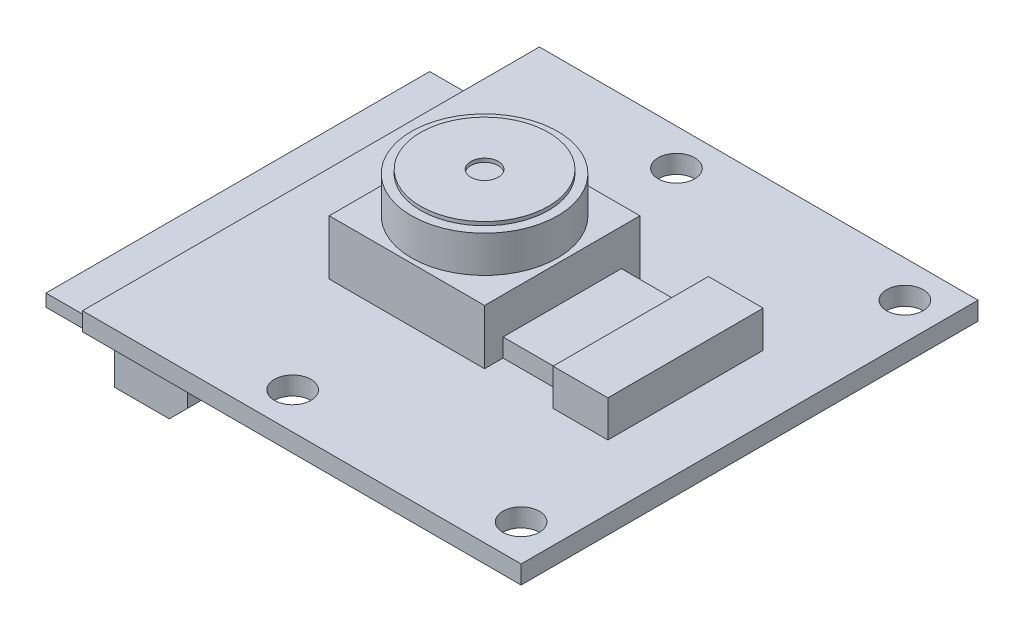
ISO-10303-21;
HEADER;
FILE_DESCRIPTION(('STEP AP214'),'2;1');
FILE_NAME('part.step','',(''),(''),'','','');
FILE_SCHEMA(('AUTOMOTIVE_DESIGN { 1 0 10303 214 1 1 1 1 }'));
ENDSEC;
DATA;
#1=APPLICATION_CONTEXT('core data for automotive mechanical design processes');
#2=APPLICATION_PROTOCOL_DEFINITION('international standard','automotive_design',2000,#1);
#3=PRODUCT_CONTEXT('',#1,'mechanical');
#4=PRODUCT('Part','Part','',(#3));
#5=PRODUCT_RELATED_PRODUCT_CATEGORY('part','',(#4));
#6=PRODUCT_DEFINITION_FORMATION('','',#4);
#7=PRODUCT_DEFINITION_CONTEXT('part definition',#1,'design');
#8=PRODUCT_DEFINITION('design','',#6,#7);
#9=PRODUCT_DEFINITION_SHAPE('','',#8);
#10=(LENGTH_UNIT() NAMED_UNIT(*) SI_UNIT(.MILLI.,.METRE.));
#11=(NAMED_UNIT(*) PLANE_ANGLE_UNIT() SI_UNIT($,.RADIAN.));
#12=(NAMED_UNIT(*) SI_UNIT($,.STERADIAN.) SOLID_ANGLE_UNIT());
#13=UNCERTAINTY_MEASURE_WITH_UNIT(LENGTH_MEASURE(1.E-05),#10,'distance_accuracy_value','');
#14=(GEOMETRIC_REPRESENTATION_CONTEXT(3) GLOBAL_UNCERTAINTY_ASSIGNED_CONTEXT((#13)) GLOBAL_UNIT_ASSIGNED_CONTEXT((#10,
#11,#12)) REPRESENTATION_CONTEXT('',''));
#15=CARTESIAN_POINT('',(0.,0.,0.));
#16=DIRECTION('',(0.,0.,1.));
#17=DIRECTION('',(1.,0.,0.));
#18=AXIS2_PLACEMENT_3D('',#15,#16,#17);
#19=CARTESIAN_POINT('',(-11.,-2.5,11.75));
#20=DIRECTION('',(-1.,0.,0.));
#21=DIRECTION('',(0.,0.,1.));
#22=AXIS2_PLACEMENT_3D('',#19,#20,#21);
#23=PLANE('',#22);
#24=DIRECTION('',(0.,0.,1.));
#25=VECTOR('',#24,1.);
#26=CARTESIAN_POINT('',(-11.,0.,11.75));
#27=LINE('',#26,#25);
#28=CARTESIAN_POINT('',(-11.,0.,-11.75));
#29=VERTEX_POINT('',#28);
#30=CARTESIAN_POINT('',(-11.,0.,11.75));
#31=VERTEX_POINT('',#30);
#32=EDGE_CURVE('E238',#29,#31,#27,.T.);
#33=ORIENTED_EDGE('',*,*,#32,.F.);
#34=DIRECTION('',(0.,1.,0.));
#35=VECTOR('',#34,1.);
#36=CARTESIAN_POINT('',(-11.,-2.5,-11.75));
#37=LINE('',#36,#35);
#38=CARTESIAN_POINT('',(-11.,-2.5,-11.75));
#39=VERTEX_POINT('',#38);
#40=EDGE_CURVE('E270',#39,#29,#37,.T.);
#41=ORIENTED_EDGE('',*,*,#40,.F.);
#42=DIRECTION('',(0.,0.,1.));
#43=VECTOR('',#42,1.);
#44=CARTESIAN_POINT('',(-11.,-2.5,11.75));
#45=LINE('',#44,#43);
#46=CARTESIAN_POINT('',(-11.,-2.5,11.75));
#47=VERTEX_POINT('',#46);
#48=EDGE_CURVE('E248',#39,#47,#45,.T.);
#49=ORIENTED_EDGE('',*,*,#48,.T.);
#50=DIRECTION('',(0.,1.,0.));
#51=VECTOR('',#50,1.);
#52=CARTESIAN_POINT('',(-11.,-2.5,11.75));
#53=LINE('',#52,#51);
#54=EDGE_CURVE('E258',#47,#31,#53,.T.);
#55=ORIENTED_EDGE('',*,*,#54,.T.);
#56=EDGE_LOOP('',(#33,#41,#49,#55));
#57=FACE_BOUND('',#56,.T.);
#58=DIRECTION('',(0.,0.,1.));
#59=VECTOR('',#58,1.);
#60=CARTESIAN_POINT('',(-11.,-1.83652307247097,10.4967751313598));
#61=LINE('',#60,#59);
#62=CARTESIAN_POINT('',(-11.,-1.83652307247097,-10.4967751313598));
#63=VERTEX_POINT('',#62);
#64=CARTESIAN_POINT('',(-11.,-1.83652307247097,10.4967751313598));
#65=VERTEX_POINT('',#64);
#66=EDGE_CURVE('E877',#63,#65,#61,.T.);
#67=ORIENTED_EDGE('',*,*,#66,.F.);
#68=DIRECTION('',(0.,-1.,0.));
#69=VECTOR('',#68,1.);
#70=CARTESIAN_POINT('',(-11.,-1.83652307247097,-10.4967751313598));
#71=LINE('',#70,#69);
#72=CARTESIAN_POINT('',(-11.,-1.16347692752903,-10.4967751313598));
#73=VERTEX_POINT('',#72);
#74=EDGE_CURVE('E235',#73,#63,#71,.T.);
#75=ORIENTED_EDGE('',*,*,#74,.F.);
#76=DIRECTION('',(0.,0.,-1.));
#77=VECTOR('',#76,1.);
#78=CARTESIAN_POINT('',(-11.,-1.16347692752903,10.4967751313598));
#79=LINE('',#78,#77);
#80=CARTESIAN_POINT('',(-11.,-1.16347692752903,10.4967751313598));
#81=VERTEX_POINT('',#80);
#82=EDGE_CURVE('E231',#81,#73,#79,.T.);
#83=ORIENTED_EDGE('',*,*,#82,.F.);
#84=DIRECTION('',(0.,1.,0.));
#85=VECTOR('',#84,1.);
#86=CARTESIAN_POINT('',(-11.,-1.83652307247097,10.4967751313598));
#87=LINE('',#86,#85);
#88=EDGE_CURVE('E880',#65,#81,#87,.T.);
#89=ORIENTED_EDGE('',*,*,#88,.F.);
#90=EDGE_LOOP('',(#67,#75,#83,#89));
#91=FACE_BOUND('',#90,.T.);
#92=ADVANCED_FACE('F39',(#57,#91),#23,.T.);
#93=CARTESIAN_POINT('',(0.,1.,0.));
#94=DIRECTION('',(0.,1.,0.));
#95=DIRECTION('',(0.,0.,1.));
#96=AXIS2_PLACEMENT_3D('',#93,#94,#95);
#97=PLANE('',#96);
#98=CARTESIAN_POINT('',(-2.5,1.,10.5));
#99=DIRECTION('',(0.,1.,0.));
#100=DIRECTION('',(0.,0.,1.));
#101=AXIS2_PLACEMENT_3D('',#98,#99,#100);
#102=CIRCLE('',#101,1.);
#103=CARTESIAN_POINT('',(-2.5,1.,11.5));
#104=VERTEX_POINT('',#103);
#105=EDGE_CURVE('E852',#104,#104,#102,.T.);
#106=ORIENTED_EDGE('',*,*,#105,.F.);
#107=EDGE_LOOP('',(#106));
#108=FACE_BOUND('',#107,.T.);
#109=CARTESIAN_POINT('',(10.,1.,-10.5));
#110=DIRECTION('',(0.,1.,0.));
#111=DIRECTION('',(0.,0.,1.));
#112=AXIS2_PLACEMENT_3D('',#109,#110,#111);
#113=CIRCLE('',#112,0.999999999999999);
#114=CARTESIAN_POINT('',(10.,1.,-9.5));
#115=VERTEX_POINT('',#114);
#116=EDGE_CURVE('E843',#115,#115,#113,.T.);
#117=ORIENTED_EDGE('',*,*,#116,.F.);
#118=EDGE_LOOP('',(#117));
#119=FACE_BOUND('',#118,.T.);
#120=CARTESIAN_POINT('',(-2.5,1.,-10.5));
#121=DIRECTION('',(0.,1.,0.));
#122=DIRECTION('',(0.,0.,1.));
#123=AXIS2_PLACEMENT_3D('',#120,#121,#122);
#124=CIRCLE('',#123,1.);
#125=CARTESIAN_POINT('',(-2.5,1.,-9.49999999999999));
#126=VERTEX_POINT('',#125);
#127=EDGE_CURVE('E834',#126,#126,#124,.T.);
#128=ORIENTED_EDGE('',*,*,#127,.F.);
#129=EDGE_LOOP('',(#128));
#130=FACE_BOUND('',#129,.T.);
#131=CARTESIAN_POINT('',(10.,1.,10.5));
#132=DIRECTION('',(0.,1.,0.));
#133=DIRECTION('',(0.,0.,1.));
#134=AXIS2_PLACEMENT_3D('',#131,#132,#133);
#135=CIRCLE('',#134,0.999999999999999);
#136=CARTESIAN_POINT('',(10.,1.,11.5));
#137=VERTEX_POINT('',#136);
#138=EDGE_CURVE('E851',#137,#137,#135,.T.);
#139=ORIENTED_EDGE('',*,*,#138,.F.);
#140=EDGE_LOOP('',(#139));
#141=FACE_BOUND('',#140,.T.);
#142=DIRECTION('',(0.,0.,-1.));
#143=VECTOR('',#142,1.);
#144=CARTESIAN_POINT('',(12.,1.,-12.5));
#145=LINE('',#144,#143);
#146=CARTESIAN_POINT('',(12.,1.,12.5));
#147=VERTEX_POINT('',#146);
#148=CARTESIAN_POINT('',(12.,1.,-12.5));
#149=VERTEX_POINT('',#148);
#150=EDGE_CURVE('E412',#147,#149,#145,.T.);
#151=ORIENTED_EDGE('',*,*,#150,.T.);
#152=DIRECTION('',(-1.,0.,0.));
#153=VECTOR('',#152,1.);
#154=CARTESIAN_POINT('',(-12.,1.,-12.5));
#155=LINE('',#154,#153);
#156=CARTESIAN_POINT('',(-12.,1.,-12.5));
#157=VERTEX_POINT('',#156);
#158=EDGE_CURVE('E416',#149,#157,#155,.T.);
#159=ORIENTED_EDGE('',*,*,#158,.T.);
#160=DIRECTION('',(0.,0.,1.));
#161=VECTOR('',#160,1.);
#162=CARTESIAN_POINT('',(-12.,1.,-12.5));
#163=LINE('',#162,#161);
#164=CARTESIAN_POINT('',(-12.,1.,12.5));
#165=VERTEX_POINT('',#164);
#166=EDGE_CURVE('E420',#157,#165,#163,.T.);
#167=ORIENTED_EDGE('',*,*,#166,.T.);
#168=DIRECTION('',(1.,0.,0.));
#169=VECTOR('',#168,1.);
#170=CARTESIAN_POINT('',(-12.,1.,12.5));
#171=LINE('',#170,#169);
#172=EDGE_CURVE('E423',#165,#147,#171,.T.);
#173=ORIENTED_EDGE('',*,*,#172,.T.);
#174=EDGE_LOOP('',(#151,#159,#167,#173));
#175=FACE_BOUND('',#174,.T.);
#176=DIRECTION('',(0.,0.,1.));
#177=VECTOR('',#176,1.);
#178=CARTESIAN_POINT('',(5.5,1.,4.2541908743633));
#179=LINE('',#178,#177);
#180=CARTESIAN_POINT('',(5.5,1.,3.2380612751322));
#181=VERTEX_POINT('',#180);
#182=CARTESIAN_POINT('',(5.5,1.,4.2541908743633));
#183=VERTEX_POINT('',#182);
#184=EDGE_CURVE('E337',#181,#183,#179,.T.);
#185=ORIENTED_EDGE('',*,*,#184,.F.);
#186=DIRECTION('',(1.,0.,0.));
#187=VECTOR('',#186,1.);
#188=CARTESIAN_POINT('',(1.75,1.,3.2380612751322));
#189=LINE('',#188,#187);
#190=CARTESIAN_POINT('',(1.75,1.,3.2380612751322));
#191=VERTEX_POINT('',#190);
#192=EDGE_CURVE('E273',#191,#181,#189,.T.);
#193=ORIENTED_EDGE('',*,*,#192,.F.);
#194=DIRECTION('',(0.,0.,-1.));
#195=VECTOR('',#194,1.);
#196=CARTESIAN_POINT('',(1.75,1.,4.25));
#197=LINE('',#196,#195);
#198=CARTESIAN_POINT('',(1.75,1.,4.25));
#199=VERTEX_POINT('',#198);
#200=EDGE_CURVE('E384',#199,#191,#197,.T.);
#201=ORIENTED_EDGE('',*,*,#200,.F.);
#202=DIRECTION('',(1.,0.,0.));
#203=VECTOR('',#202,1.);
#204=CARTESIAN_POINT('',(-6.75,1.,4.25));
#205=LINE('',#204,#203);
#206=CARTESIAN_POINT('',(-6.75,1.,4.25));
#207=VERTEX_POINT('',#206);
#208=EDGE_CURVE('E374',#207,#199,#205,.T.);
#209=ORIENTED_EDGE('',*,*,#208,.F.);
#210=DIRECTION('',(0.,0.,1.));
#211=VECTOR('',#210,1.);
#212=CARTESIAN_POINT('',(-6.75,1.,4.25));
#213=LINE('',#212,#211);
#214=CARTESIAN_POINT('',(-6.75,1.,-4.25));
#215=VERTEX_POINT('',#214);
#216=EDGE_CURVE('E391',#215,#207,#213,.T.);
#217=ORIENTED_EDGE('',*,*,#216,.F.);
#218=DIRECTION('',(-1.,0.,0.));
#219=VECTOR('',#218,1.);
#220=CARTESIAN_POINT('',(-6.75,1.,-4.25));
#221=LINE('',#220,#219);
#222=CARTESIAN_POINT('',(1.75,1.,-4.25));
#223=VERTEX_POINT('',#222);
#224=EDGE_CURVE('E388',#223,#215,#221,.T.);
#225=ORIENTED_EDGE('',*,*,#224,.F.);
#226=CARTESIAN_POINT('',(1.75,1.,-3.23806127513216));
#227=VERTEX_POINT('',#226);
#228=EDGE_CURVE('E362',#227,#223,#197,.T.);
#229=ORIENTED_EDGE('',*,*,#228,.F.);
#230=DIRECTION('',(-1.,0.,0.));
#231=VECTOR('',#230,1.);
#232=CARTESIAN_POINT('',(1.75,1.,-3.23806127513216));
#233=LINE('',#232,#231);
#234=CARTESIAN_POINT('',(5.5,1.,-3.23806127513216));
#235=VERTEX_POINT('',#234);
#236=EDGE_CURVE('E287',#235,#227,#233,.T.);
#237=ORIENTED_EDGE('',*,*,#236,.F.);
#238=CARTESIAN_POINT('',(5.5,1.,-4.2458091256367));
#239=VERTEX_POINT('',#238);
#240=EDGE_CURVE('E338',#239,#235,#179,.T.);
#241=ORIENTED_EDGE('',*,*,#240,.F.);
#242=DIRECTION('',(-1.,0.,0.));
#243=VECTOR('',#242,1.);
#244=CARTESIAN_POINT('',(5.5,1.,-4.2458091256367));
#245=LINE('',#244,#243);
#246=CARTESIAN_POINT('',(8.5,1.,-4.2458091256367));
#247=VERTEX_POINT('',#246);
#248=EDGE_CURVE('E334',#247,#239,#245,.T.);
#249=ORIENTED_EDGE('',*,*,#248,.F.);
#250=DIRECTION('',(0.,0.,-1.));
#251=VECTOR('',#250,1.);
#252=CARTESIAN_POINT('',(8.5,1.,4.2541908743633));
#253=LINE('',#252,#251);
#254=CARTESIAN_POINT('',(8.5,1.,4.2541908743633));
#255=VERTEX_POINT('',#254);
#256=EDGE_CURVE('E315',#255,#247,#253,.T.);
#257=ORIENTED_EDGE('',*,*,#256,.F.);
#258=DIRECTION('',(1.,0.,0.));
#259=VECTOR('',#258,1.);
#260=CARTESIAN_POINT('',(5.5,1.,4.2541908743633));
#261=LINE('',#260,#259);
#262=EDGE_CURVE('E321',#183,#255,#261,.T.);
#263=ORIENTED_EDGE('',*,*,#262,.F.);
#264=EDGE_LOOP('',(#185,#193,#201,#209,#217,#225,#229,#237,#241,#249,#257,#263));
#265=FACE_BOUND('',#264,.T.);
#266=ADVANCED_FACE('F505',(#108,#119,#130,#141,#175,#265),#97,.T.);
#267=CARTESIAN_POINT('',(1.75,4.,4.25));
#268=DIRECTION('',(-1.,0.,0.));
#269=DIRECTION('',(0.,0.,1.));
#270=AXIS2_PLACEMENT_3D('',#267,#268,#269);
#271=PLANE('',#270);
#272=DIRECTION('',(0.,-1.,0.));
#273=VECTOR('',#272,1.);
#274=CARTESIAN_POINT('',(1.75,2.,3.2380612751322));
#275=LINE('',#274,#273);
#276=CARTESIAN_POINT('',(1.75,2.,3.2380612751322));
#277=VERTEX_POINT('',#276);
#278=EDGE_CURVE('E312',#277,#191,#275,.T.);
#279=ORIENTED_EDGE('',*,*,#278,.F.);
#280=DIRECTION('',(0.,0.,1.));
#281=VECTOR('',#280,1.);
#282=CARTESIAN_POINT('',(1.75,2.,-3.23806127513216));
#283=LINE('',#282,#281);
#284=CARTESIAN_POINT('',(1.75,2.,-3.23806127513216));
#285=VERTEX_POINT('',#284);
#286=EDGE_CURVE('E282',#285,#277,#283,.T.);
#287=ORIENTED_EDGE('',*,*,#286,.F.);
#288=DIRECTION('',(0.,-1.,0.));
#289=VECTOR('',#288,1.);
#290=CARTESIAN_POINT('',(1.75,2.,-3.23806127513216));
#291=LINE('',#290,#289);
#292=EDGE_CURVE('E297',#285,#227,#291,.T.);
#293=ORIENTED_EDGE('',*,*,#292,.T.);
#294=ORIENTED_EDGE('',*,*,#228,.T.);
#295=DIRECTION('',(0.,-1.,0.));
#296=VECTOR('',#295,1.);
#297=CARTESIAN_POINT('',(1.75,4.,-4.25));
#298=LINE('',#297,#296);
#299=CARTESIAN_POINT('',(1.75,4.,-4.25));
#300=VERTEX_POINT('',#299);
#301=EDGE_CURVE('E407',#300,#223,#298,.T.);
#302=ORIENTED_EDGE('',*,*,#301,.F.);
#303=DIRECTION('',(0.,0.,-1.));
#304=VECTOR('',#303,1.);
#305=CARTESIAN_POINT('',(1.75,4.,4.25));
#306=LINE('',#305,#304);
#307=CARTESIAN_POINT('',(1.75,4.,4.25));
#308=VERTEX_POINT('',#307);
#309=EDGE_CURVE('E369',#308,#300,#306,.T.);
#310=ORIENTED_EDGE('',*,*,#309,.F.);
#311=DIRECTION('',(0.,-1.,0.));
#312=VECTOR('',#311,1.);
#313=CARTESIAN_POINT('',(1.75,4.,4.25));
#314=LINE('',#313,#312);
#315=EDGE_CURVE('E383',#308,#199,#314,.T.);
#316=ORIENTED_EDGE('',*,*,#315,.T.);
#317=ORIENTED_EDGE('',*,*,#200,.T.);
#318=EDGE_LOOP('',(#279,#287,#293,#294,#302,#310,#316,#317));
#319=FACE_BOUND('',#318,.T.);
#320=ADVANCED_FACE('F508',(#319),#271,.F.);
#321=CARTESIAN_POINT('',(5.5,3.,4.2541908743633));
#322=DIRECTION('',(1.,0.,0.));
#323=DIRECTION('',(0.,0.,-1.));
#324=AXIS2_PLACEMENT_3D('',#321,#322,#323);
#325=PLANE('',#324);
#326=DIRECTION('',(0.,-1.,0.));
#327=VECTOR('',#326,1.);
#328=CARTESIAN_POINT('',(5.5,2.,3.2380612751322));
#329=LINE('',#328,#327);
#330=CARTESIAN_POINT('',(5.5,2.,3.2380612751322));
#331=VERTEX_POINT('',#330);
#332=EDGE_CURVE('E308',#331,#181,#329,.T.);
#333=ORIENTED_EDGE('',*,*,#332,.T.);
#334=ORIENTED_EDGE('',*,*,#184,.T.);
#335=DIRECTION('',(0.,-1.,0.));
#336=VECTOR('',#335,1.);
#337=CARTESIAN_POINT('',(5.5,3.,4.2541908743633));
#338=LINE('',#337,#336);
#339=CARTESIAN_POINT('',(5.5,3.,4.2541908743633));
#340=VERTEX_POINT('',#339);
#341=EDGE_CURVE('E347',#340,#183,#338,.T.);
#342=ORIENTED_EDGE('',*,*,#341,.F.);
#343=DIRECTION('',(0.,0.,1.));
#344=VECTOR('',#343,1.);
#345=CARTESIAN_POINT('',(5.5,3.,4.2541908743633));
#346=LINE('',#345,#344);
#347=CARTESIAN_POINT('',(5.5,3.,-4.2458091256367));
#348=VERTEX_POINT('',#347);
#349=EDGE_CURVE('E324',#348,#340,#346,.T.);
#350=ORIENTED_EDGE('',*,*,#349,.F.);
#351=DIRECTION('',(0.,-1.,0.));
#352=VECTOR('',#351,1.);
#353=CARTESIAN_POINT('',(5.5,3.,-4.2458091256367));
#354=LINE('',#353,#352);
#355=EDGE_CURVE('E351',#348,#239,#354,.T.);
#356=ORIENTED_EDGE('',*,*,#355,.T.);
#357=ORIENTED_EDGE('',*,*,#240,.T.);
#358=DIRECTION('',(0.,-1.,0.));
#359=VECTOR('',#358,1.);
#360=CARTESIAN_POINT('',(5.5,2.,-3.23806127513216));
#361=LINE('',#360,#359);
#362=CARTESIAN_POINT('',(5.5,2.,-3.23806127513216));
#363=VERTEX_POINT('',#362);
#364=EDGE_CURVE('E305',#363,#235,#361,.T.);
#365=ORIENTED_EDGE('',*,*,#364,.F.);
#366=DIRECTION('',(0.,0.,-1.));
#367=VECTOR('',#366,1.);
#368=CARTESIAN_POINT('',(5.5,2.,-3.23806127513216));
#369=LINE('',#368,#367);
#370=EDGE_CURVE('E291',#331,#363,#369,.T.);
#371=ORIENTED_EDGE('',*,*,#370,.F.);
#372=EDGE_LOOP('',(#333,#334,#342,#350,#356,#357,#365,#371));
#373=FACE_BOUND('',#372,.T.);
#374=ADVANCED_FACE('F582',(#373),#325,.F.);
#375=CARTESIAN_POINT('',(12.,1.,-12.5));
#376=DIRECTION('',(-1.,0.,0.));
#377=DIRECTION('',(0.,0.,1.));
#378=AXIS2_PLACEMENT_3D('',#375,#376,#377);
#379=PLANE('',#378);
#380=DIRECTION('',(0.,0.,-1.));
#381=VECTOR('',#380,1.);
#382=CARTESIAN_POINT('',(12.,0.,-12.5));
#383=LINE('',#382,#381);
#384=CARTESIAN_POINT('',(12.,0.,12.5));
#385=VERTEX_POINT('',#384);
#386=CARTESIAN_POINT('',(12.,0.,-12.5));
#387=VERTEX_POINT('',#386);
#388=EDGE_CURVE('E411',#385,#387,#383,.T.);
#389=ORIENTED_EDGE('',*,*,#388,.T.);
#390=DIRECTION('',(0.,-1.,0.));
#391=VECTOR('',#390,1.);
#392=CARTESIAN_POINT('',(12.,1.,-12.5));
#393=LINE('',#392,#391);
#394=EDGE_CURVE('E368',#149,#387,#393,.T.);
#395=ORIENTED_EDGE('',*,*,#394,.F.);
#396=ORIENTED_EDGE('',*,*,#150,.F.);
#397=DIRECTION('',(0.,-1.,0.));
#398=VECTOR('',#397,1.);
#399=CARTESIAN_POINT('',(12.,1.,12.5));
#400=LINE('',#399,#398);
#401=EDGE_CURVE('E426',#147,#385,#400,.T.);
#402=ORIENTED_EDGE('',*,*,#401,.T.);
#403=EDGE_LOOP('',(#389,#395,#396,#402));
#404=FACE_BOUND('',#403,.T.);
#405=ADVANCED_FACE('F492',(#404),#379,.F.);
#406=CARTESIAN_POINT('',(-12.,1.,-12.5));
#407=DIRECTION('',(0.,0.,1.));
#408=DIRECTION('',(1.,0.,0.));
#409=AXIS2_PLACEMENT_3D('',#406,#407,#408);
#410=PLANE('',#409);
#411=DIRECTION('',(-1.,0.,0.));
#412=VECTOR('',#411,1.);
#413=CARTESIAN_POINT('',(-12.,0.,-12.5));
#414=LINE('',#413,#412);
#415=CARTESIAN_POINT('',(-12.,0.,-12.5));
#416=VERTEX_POINT('',#415);
#417=EDGE_CURVE('E430',#387,#416,#414,.T.);
#418=ORIENTED_EDGE('',*,*,#417,.T.);
#419=DIRECTION('',(0.,-1.,0.));
#420=VECTOR('',#419,1.);
#421=CARTESIAN_POINT('',(-12.,1.,-12.5));
#422=LINE('',#421,#420);
#423=EDGE_CURVE('E445',#157,#416,#422,.T.);
#424=ORIENTED_EDGE('',*,*,#423,.F.);
#425=ORIENTED_EDGE('',*,*,#158,.F.);
#426=ORIENTED_EDGE('',*,*,#394,.T.);
#427=EDGE_LOOP('',(#418,#424,#425,#426));
#428=FACE_BOUND('',#427,.T.);
#429=ADVANCED_FACE('F503',(#428),#410,.F.);
#430=CARTESIAN_POINT('',(-12.,1.,-12.5));
#431=DIRECTION('',(1.,0.,0.));
#432=DIRECTION('',(0.,0.,-1.));
#433=AXIS2_PLACEMENT_3D('',#430,#431,#432);
#434=PLANE('',#433);
#435=DIRECTION('',(0.,0.,1.));
#436=VECTOR('',#435,1.);
#437=CARTESIAN_POINT('',(-12.,0.,-12.5));
#438=LINE('',#437,#436);
#439=CARTESIAN_POINT('',(-12.,0.,12.5));
#440=VERTEX_POINT('',#439);
#441=EDGE_CURVE('E433',#416,#440,#438,.T.);
#442=ORIENTED_EDGE('',*,*,#441,.T.);
#443=DIRECTION('',(0.,-1.,0.));
#444=VECTOR('',#443,1.);
#445=CARTESIAN_POINT('',(-12.,1.,12.5));
#446=LINE('',#445,#444);
#447=EDGE_CURVE('E441',#165,#440,#446,.T.);
#448=ORIENTED_EDGE('',*,*,#447,.F.);
#449=ORIENTED_EDGE('',*,*,#166,.F.);
#450=ORIENTED_EDGE('',*,*,#423,.T.);
#451=EDGE_LOOP('',(#442,#448,#449,#450));
#452=FACE_BOUND('',#451,.T.);
#453=ADVANCED_FACE('F500',(#452),#434,.F.);
#454=CARTESIAN_POINT('',(-12.,1.,12.5));
#455=DIRECTION('',(0.,0.,-1.));
#456=DIRECTION('',(-1.,0.,0.));
#457=AXIS2_PLACEMENT_3D('',#454,#455,#456);
#458=PLANE('',#457);
#459=DIRECTION('',(1.,0.,0.));
#460=VECTOR('',#459,1.);
#461=CARTESIAN_POINT('',(-12.,0.,12.5));
#462=LINE('',#461,#460);
#463=EDGE_CURVE('E417',#440,#385,#462,.T.);
#464=ORIENTED_EDGE('',*,*,#463,.T.);
#465=ORIENTED_EDGE('',*,*,#401,.F.);
#466=ORIENTED_EDGE('',*,*,#172,.F.);
#467=ORIENTED_EDGE('',*,*,#447,.T.);
#468=EDGE_LOOP('',(#464,#465,#466,#467));
#469=FACE_BOUND('',#468,.T.);
#470=ADVANCED_FACE('F484',(#469),#458,.F.);
#471=CARTESIAN_POINT('',(0.,0.,0.));
#472=DIRECTION('',(0.,1.,0.));
#473=DIRECTION('',(0.,0.,1.));
#474=AXIS2_PLACEMENT_3D('',#471,#472,#473);
#475=PLANE('',#474);
#476=CARTESIAN_POINT('',(-2.5,0.,10.5));
#477=DIRECTION('',(0.,1.,0.));
#478=DIRECTION('',(0.,0.,1.));
#479=AXIS2_PLACEMENT_3D('',#476,#477,#478);
#480=CIRCLE('',#479,1.);
#481=CARTESIAN_POINT('',(-2.5,0.,11.5));
#482=VERTEX_POINT('',#481);
#483=EDGE_CURVE('E847',#482,#482,#480,.T.);
#484=ORIENTED_EDGE('',*,*,#483,.T.);
#485=EDGE_LOOP('',(#484));
#486=FACE_BOUND('',#485,.T.);
#487=CARTESIAN_POINT('',(10.,0.,-10.5));
#488=DIRECTION('',(0.,1.,0.));
#489=DIRECTION('',(0.,0.,1.));
#490=AXIS2_PLACEMENT_3D('',#487,#488,#489);
#491=CIRCLE('',#490,0.999999999999999);
#492=CARTESIAN_POINT('',(10.,0.,-9.5));
#493=VERTEX_POINT('',#492);
#494=EDGE_CURVE('E856',#493,#493,#491,.T.);
#495=ORIENTED_EDGE('',*,*,#494,.T.);
#496=EDGE_LOOP('',(#495));
#497=FACE_BOUND('',#496,.T.);
#498=CARTESIAN_POINT('',(-2.5,0.,-10.5));
#499=DIRECTION('',(0.,1.,0.));
#500=DIRECTION('',(0.,0.,1.));
#501=AXIS2_PLACEMENT_3D('',#498,#499,#500);
#502=CIRCLE('',#501,1.);
#503=CARTESIAN_POINT('',(-2.5,0.,-9.49999999999999));
#504=VERTEX_POINT('',#503);
#505=EDGE_CURVE('E839',#504,#504,#502,.T.);
#506=ORIENTED_EDGE('',*,*,#505,.T.);
#507=EDGE_LOOP('',(#506));
#508=FACE_BOUND('',#507,.T.);
#509=CARTESIAN_POINT('',(10.,0.,10.5));
#510=DIRECTION('',(0.,1.,0.));
#511=DIRECTION('',(0.,0.,1.));
#512=AXIS2_PLACEMENT_3D('',#509,#510,#511);
#513=CIRCLE('',#512,0.999999999999999);
#514=CARTESIAN_POINT('',(10.,0.,11.5));
#515=VERTEX_POINT('',#514);
#516=EDGE_CURVE('E863',#515,#515,#513,.T.);
#517=ORIENTED_EDGE('',*,*,#516,.T.);
#518=EDGE_LOOP('',(#517));
#519=FACE_BOUND('',#518,.T.);
#520=DIRECTION('',(-1.,0.,0.));
#521=VECTOR('',#520,1.);
#522=CARTESIAN_POINT('',(-11.,0.,-11.75));
#523=LINE('',#522,#521);
#524=CARTESIAN_POINT('',(-7.,0.,-11.75));
#525=VERTEX_POINT('',#524);
#526=EDGE_CURVE('E253',#525,#29,#523,.T.);
#527=ORIENTED_EDGE('',*,*,#526,.T.);
#528=ORIENTED_EDGE('',*,*,#32,.T.);
#529=DIRECTION('',(1.,0.,0.));
#530=VECTOR('',#529,1.);
#531=CARTESIAN_POINT('',(-11.,0.,11.75));
#532=LINE('',#531,#530);
#533=CARTESIAN_POINT('',(-7.,0.,11.75));
#534=VERTEX_POINT('',#533);
#535=EDGE_CURVE('E243',#31,#534,#532,.T.);
#536=ORIENTED_EDGE('',*,*,#535,.T.);
#537=DIRECTION('',(0.,0.,-1.));
#538=VECTOR('',#537,1.);
#539=CARTESIAN_POINT('',(-7.,0.,11.75));
#540=LINE('',#539,#538);
#541=EDGE_CURVE('E263',#534,#525,#540,.T.);
#542=ORIENTED_EDGE('',*,*,#541,.T.);
#543=EDGE_LOOP('',(#527,#528,#536,#542));
#544=FACE_BOUND('',#543,.T.);
#545=ORIENTED_EDGE('',*,*,#388,.F.);
#546=ORIENTED_EDGE('',*,*,#463,.F.);
#547=ORIENTED_EDGE('',*,*,#441,.F.);
#548=ORIENTED_EDGE('',*,*,#417,.F.);
#549=EDGE_LOOP('',(#545,#546,#547,#548));
#550=FACE_BOUND('',#549,.T.);
#551=ADVANCED_FACE('F480',(#486,#497,#508,#519,#544,#550),#475,.F.);
#552=CARTESIAN_POINT('',(-6.75,4.,-4.25));
#553=DIRECTION('',(0.,0.,1.));
#554=DIRECTION('',(1.,0.,0.));
#555=AXIS2_PLACEMENT_3D('',#552,#553,#554);
#556=PLANE('',#555);
#557=ORIENTED_EDGE('',*,*,#224,.T.);
#558=DIRECTION('',(0.,-1.,0.));
#559=VECTOR('',#558,1.);
#560=CARTESIAN_POINT('',(-6.75,4.,-4.25));
#561=LINE('',#560,#559);
#562=CARTESIAN_POINT('',(-6.75,4.,-4.25));
#563=VERTEX_POINT('',#562);
#564=EDGE_CURVE('E403',#563,#215,#561,.T.);
#565=ORIENTED_EDGE('',*,*,#564,.F.);
#566=DIRECTION('',(-1.,0.,0.));
#567=VECTOR('',#566,1.);
#568=CARTESIAN_POINT('',(-6.75,4.,-4.25));
#569=LINE('',#568,#567);
#570=EDGE_CURVE('E373',#300,#563,#569,.T.);
#571=ORIENTED_EDGE('',*,*,#570,.F.);
#572=ORIENTED_EDGE('',*,*,#301,.T.);
#573=EDGE_LOOP('',(#557,#565,#571,#572));
#574=FACE_BOUND('',#573,.T.);
#575=ADVANCED_FACE('F483',(#574),#556,.F.);
#576=CARTESIAN_POINT('',(-6.75,4.,4.25));
#577=DIRECTION('',(1.,0.,0.));
#578=DIRECTION('',(0.,0.,-1.));
#579=AXIS2_PLACEMENT_3D('',#576,#577,#578);
#580=PLANE('',#579);
#581=ORIENTED_EDGE('',*,*,#216,.T.);
#582=DIRECTION('',(0.,-1.,0.));
#583=VECTOR('',#582,1.);
#584=CARTESIAN_POINT('',(-6.75,4.,4.25));
#585=LINE('',#584,#583);
#586=CARTESIAN_POINT('',(-6.75,4.,4.25));
#587=VERTEX_POINT('',#586);
#588=EDGE_CURVE('E400',#587,#207,#585,.T.);
#589=ORIENTED_EDGE('',*,*,#588,.F.);
#590=DIRECTION('',(0.,0.,1.));
#591=VECTOR('',#590,1.);
#592=CARTESIAN_POINT('',(-6.75,4.,4.25));
#593=LINE('',#592,#591);
#594=EDGE_CURVE('E377',#563,#587,#593,.T.);
#595=ORIENTED_EDGE('',*,*,#594,.F.);
#596=ORIENTED_EDGE('',*,*,#564,.T.);
#597=EDGE_LOOP('',(#581,#589,#595,#596));
#598=FACE_BOUND('',#597,.T.);
#599=ADVANCED_FACE('F535',(#598),#580,.F.);
#600=CARTESIAN_POINT('',(-6.75,4.,4.25));
#601=DIRECTION('',(0.,0.,-1.));
#602=DIRECTION('',(-1.,0.,0.));
#603=AXIS2_PLACEMENT_3D('',#600,#601,#602);
#604=PLANE('',#603);
#605=ORIENTED_EDGE('',*,*,#208,.T.);
#606=ORIENTED_EDGE('',*,*,#315,.F.);
#607=DIRECTION('',(1.,0.,0.));
#608=VECTOR('',#607,1.);
#609=CARTESIAN_POINT('',(-6.75,4.,4.25));
#610=LINE('',#609,#608);
#611=EDGE_CURVE('E380',#587,#308,#610,.T.);
#612=ORIENTED_EDGE('',*,*,#611,.F.);
#613=ORIENTED_EDGE('',*,*,#588,.T.);
#614=EDGE_LOOP('',(#605,#606,#612,#613));
#615=FACE_BOUND('',#614,.T.);
#616=ADVANCED_FACE('F542',(#615),#604,.F.);
#617=CARTESIAN_POINT('',(0.,4.,0.));
#618=DIRECTION('',(0.,-1.,0.));
#619=DIRECTION('',(0.,0.,-1.));
#620=AXIS2_PLACEMENT_3D('',#617,#618,#619);
#621=PLANE('',#620);
#622=CARTESIAN_POINT('',(-2.5,4.,0.));
#623=DIRECTION('',(0.,1.,0.));
#624=DIRECTION('',(0.,0.,1.));
#625=AXIS2_PLACEMENT_3D('',#622,#623,#624);
#626=CIRCLE('',#625,4.);
#627=CARTESIAN_POINT('',(-2.5,4.,4.));
#628=VERTEX_POINT('',#627);
#629=EDGE_CURVE('E363',#628,#628,#626,.T.);
#630=ORIENTED_EDGE('',*,*,#629,.F.);
#631=EDGE_LOOP('',(#630));
#632=FACE_BOUND('',#631,.T.);
#633=ORIENTED_EDGE('',*,*,#309,.T.);
#634=ORIENTED_EDGE('',*,*,#570,.T.);
#635=ORIENTED_EDGE('',*,*,#594,.T.);
#636=ORIENTED_EDGE('',*,*,#611,.T.);
#637=EDGE_LOOP('',(#633,#634,#635,#636));
#638=FACE_BOUND('',#637,.T.);
#639=ADVANCED_FACE('F539',(#632,#638),#621,.F.);
#640=CARTESIAN_POINT('',(-2.5,6.,0.));
#641=DIRECTION('',(0.,-1.,0.));
#642=DIRECTION('',(0.,0.,-1.));
#643=AXIS2_PLACEMENT_3D('',#640,#641,#642);
#644=CYLINDRICAL_SURFACE('',#643,4.);
#645=CARTESIAN_POINT('',(-2.5,6.,0.));
#646=DIRECTION('',(0.,1.,0.));
#647=DIRECTION('',(0.,0.,1.));
#648=AXIS2_PLACEMENT_3D('',#645,#646,#647);
#649=CIRCLE('',#648,4.);
#650=CARTESIAN_POINT('',(-2.5,6.,4.));
#651=VERTEX_POINT('',#650);
#652=EDGE_CURVE('E358',#651,#651,#649,.T.);
#653=ORIENTED_EDGE('',*,*,#652,.F.);
#654=EDGE_LOOP('',(#653));
#655=FACE_BOUND('',#654,.T.);
#656=ORIENTED_EDGE('',*,*,#629,.T.);
#657=EDGE_LOOP('',(#656));
#658=FACE_BOUND('',#657,.T.);
#659=ADVANCED_FACE('F549',(#655,#658),#644,.T.);
#660=CARTESIAN_POINT('',(-2.5,6.,0.));
#661=DIRECTION('',(0.,1.,0.));
#662=DIRECTION('',(0.,0.,1.));
#663=AXIS2_PLACEMENT_3D('',#660,#661,#662);
#664=PLANE('',#663);
#665=CARTESIAN_POINT('',(-2.5,6.,0.));
#666=DIRECTION('',(0.,1.,0.));
#667=DIRECTION('',(0.,0.,1.));
#668=AXIS2_PLACEMENT_3D('',#665,#666,#667);
#669=CIRCLE('',#668,3.5);
#670=CARTESIAN_POINT('',(-2.5,6.,3.5));
#671=VERTEX_POINT('',#670);
#672=EDGE_CURVE('E11',#671,#671,#669,.T.);
#673=ORIENTED_EDGE('',*,*,#672,.F.);
#674=EDGE_LOOP('',(#673));
#675=FACE_BOUND('',#674,.T.);
#676=ORIENTED_EDGE('',*,*,#652,.T.);
#677=EDGE_LOOP('',(#676));
#678=FACE_BOUND('',#677,.T.);
#679=ADVANCED_FACE('F591',(#675,#678),#664,.T.);
#680=CARTESIAN_POINT('',(8.5,3.,4.2541908743633));
#681=DIRECTION('',(-1.,0.,0.));
#682=DIRECTION('',(0.,0.,1.));
#683=AXIS2_PLACEMENT_3D('',#680,#681,#682);
#684=PLANE('',#683);
#685=ORIENTED_EDGE('',*,*,#256,.T.);
#686=DIRECTION('',(0.,-1.,0.));
#687=VECTOR('',#686,1.);
#688=CARTESIAN_POINT('',(8.5,3.,-4.2458091256367));
#689=LINE('',#688,#687);
#690=CARTESIAN_POINT('',(8.5,3.,-4.2458091256367));
#691=VERTEX_POINT('',#690);
#692=EDGE_CURVE('E355',#691,#247,#689,.T.);
#693=ORIENTED_EDGE('',*,*,#692,.F.);
#694=DIRECTION('',(0.,0.,-1.));
#695=VECTOR('',#694,1.);
#696=CARTESIAN_POINT('',(8.5,3.,4.2541908743633));
#697=LINE('',#696,#695);
#698=CARTESIAN_POINT('',(8.5,3.,4.2541908743633));
#699=VERTEX_POINT('',#698);
#700=EDGE_CURVE('E316',#699,#691,#697,.T.);
#701=ORIENTED_EDGE('',*,*,#700,.F.);
#702=DIRECTION('',(0.,-1.,0.));
#703=VECTOR('',#702,1.);
#704=CARTESIAN_POINT('',(8.5,3.,4.2541908743633));
#705=LINE('',#704,#703);
#706=EDGE_CURVE('E330',#699,#255,#705,.T.);
#707=ORIENTED_EDGE('',*,*,#706,.T.);
#708=EDGE_LOOP('',(#685,#693,#701,#707));
#709=FACE_BOUND('',#708,.T.);
#710=ADVANCED_FACE('F587',(#709),#684,.F.);
#711=CARTESIAN_POINT('',(5.5,3.,-4.2458091256367));
#712=DIRECTION('',(0.,0.,1.));
#713=DIRECTION('',(1.,0.,0.));
#714=AXIS2_PLACEMENT_3D('',#711,#712,#713);
#715=PLANE('',#714);
#716=ORIENTED_EDGE('',*,*,#248,.T.);
#717=ORIENTED_EDGE('',*,*,#355,.F.);
#718=DIRECTION('',(-1.,0.,0.));
#719=VECTOR('',#718,1.);
#720=CARTESIAN_POINT('',(5.5,3.,-4.2458091256367));
#721=LINE('',#720,#719);
#722=EDGE_CURVE('E320',#691,#348,#721,.T.);
#723=ORIENTED_EDGE('',*,*,#722,.F.);
#724=ORIENTED_EDGE('',*,*,#692,.T.);
#725=EDGE_LOOP('',(#716,#717,#723,#724));
#726=FACE_BOUND('',#725,.T.);
#727=ADVANCED_FACE('F580',(#726),#715,.F.);
#728=CARTESIAN_POINT('',(5.5,3.,4.2541908743633));
#729=DIRECTION('',(0.,0.,-1.));
#730=DIRECTION('',(-1.,0.,0.));
#731=AXIS2_PLACEMENT_3D('',#728,#729,#730);
#732=PLANE('',#731);
#733=ORIENTED_EDGE('',*,*,#262,.T.);
#734=ORIENTED_EDGE('',*,*,#706,.F.);
#735=DIRECTION('',(1.,0.,0.));
#736=VECTOR('',#735,1.);
#737=CARTESIAN_POINT('',(5.5,3.,4.2541908743633));
#738=LINE('',#737,#736);
#739=EDGE_CURVE('E327',#340,#699,#738,.T.);
#740=ORIENTED_EDGE('',*,*,#739,.F.);
#741=ORIENTED_EDGE('',*,*,#341,.T.);
#742=EDGE_LOOP('',(#733,#734,#740,#741));
#743=FACE_BOUND('',#742,.T.);
#744=ADVANCED_FACE('F576',(#743),#732,.F.);
#745=CARTESIAN_POINT('',(0.,3.,0.));
#746=DIRECTION('',(0.,-1.,0.));
#747=DIRECTION('',(0.,0.,-1.));
#748=AXIS2_PLACEMENT_3D('',#745,#746,#747);
#749=PLANE('',#748);
#750=ORIENTED_EDGE('',*,*,#700,.T.);
#751=ORIENTED_EDGE('',*,*,#722,.T.);
#752=ORIENTED_EDGE('',*,*,#349,.T.);
#753=ORIENTED_EDGE('',*,*,#739,.T.);
#754=EDGE_LOOP('',(#750,#751,#752,#753));
#755=FACE_BOUND('',#754,.T.);
#756=ADVANCED_FACE('F572',(#755),#749,.F.);
#757=CARTESIAN_POINT('',(1.75,2.,3.2380612751322));
#758=DIRECTION('',(0.,0.,-1.));
#759=DIRECTION('',(-1.,0.,0.));
#760=AXIS2_PLACEMENT_3D('',#757,#758,#759);
#761=PLANE('',#760);
#762=ORIENTED_EDGE('',*,*,#192,.T.);
#763=ORIENTED_EDGE('',*,*,#332,.F.);
#764=DIRECTION('',(1.,0.,0.));
#765=VECTOR('',#764,1.);
#766=CARTESIAN_POINT('',(1.75,2.,3.2380612751322));
#767=LINE('',#766,#765);
#768=EDGE_CURVE('E286',#277,#331,#767,.T.);
#769=ORIENTED_EDGE('',*,*,#768,.F.);
#770=ORIENTED_EDGE('',*,*,#278,.T.);
#771=EDGE_LOOP('',(#762,#763,#769,#770));
#772=FACE_BOUND('',#771,.T.);
#773=ADVANCED_FACE('F568',(#772),#761,.F.);
#774=CARTESIAN_POINT('',(1.75,2.,-3.23806127513216));
#775=DIRECTION('',(0.,0.,1.));
#776=DIRECTION('',(1.,0.,0.));
#777=AXIS2_PLACEMENT_3D('',#774,#775,#776);
#778=PLANE('',#777);
#779=ORIENTED_EDGE('',*,*,#236,.T.);
#780=ORIENTED_EDGE('',*,*,#292,.F.);
#781=DIRECTION('',(-1.,0.,0.));
#782=VECTOR('',#781,1.);
#783=CARTESIAN_POINT('',(1.75,2.,-3.23806127513216));
#784=LINE('',#783,#782);
#785=EDGE_CURVE('E294',#363,#285,#784,.T.);
#786=ORIENTED_EDGE('',*,*,#785,.F.);
#787=ORIENTED_EDGE('',*,*,#364,.T.);
#788=EDGE_LOOP('',(#779,#780,#786,#787));
#789=FACE_BOUND('',#788,.T.);
#790=ADVANCED_FACE('F564',(#789),#778,.F.);
#791=CARTESIAN_POINT('',(0.,2.,0.));
#792=DIRECTION('',(0.,1.,0.));
#793=DIRECTION('',(0.,0.,1.));
#794=AXIS2_PLACEMENT_3D('',#791,#792,#793);
#795=PLANE('',#794);
#796=ORIENTED_EDGE('',*,*,#286,.T.);
#797=ORIENTED_EDGE('',*,*,#768,.T.);
#798=ORIENTED_EDGE('',*,*,#370,.T.);
#799=ORIENTED_EDGE('',*,*,#785,.T.);
#800=EDGE_LOOP('',(#796,#797,#798,#799));
#801=FACE_BOUND('',#800,.T.);
#802=ADVANCED_FACE('F562',(#801),#795,.T.);
#803=CARTESIAN_POINT('',(-11.,-2.5,-11.75));
#804=DIRECTION('',(0.,0.,-1.));
#805=DIRECTION('',(-1.,0.,0.));
#806=AXIS2_PLACEMENT_3D('',#803,#804,#805);
#807=PLANE('',#806);
#808=DIRECTION('',(0.,1.,0.));
#809=VECTOR('',#808,1.);
#810=CARTESIAN_POINT('',(-7.,-2.5,-11.75));
#811=LINE('',#810,#809);
#812=CARTESIAN_POINT('',(-7.,-1.5,-11.75));
#813=VERTEX_POINT('',#812);
#814=EDGE_CURVE('E274',#813,#525,#811,.T.);
#815=ORIENTED_EDGE('',*,*,#814,.F.);
#816=DIRECTION('',(0.707106781186549,0.707106781186546,0.));
#817=VECTOR('',#816,1.);
#818=CARTESIAN_POINT('',(-9.50000000000001,-4.,-11.75));
#819=LINE('',#818,#817);
#820=CARTESIAN_POINT('',(-8.00000000000001,-2.5,-11.75));
#821=VERTEX_POINT('',#820);
#822=EDGE_CURVE('E455',#813,#821,#819,.F.);
#823=ORIENTED_EDGE('',*,*,#822,.T.);
#824=DIRECTION('',(-1.,0.,0.));
#825=VECTOR('',#824,1.);
#826=CARTESIAN_POINT('',(-11.,-2.5,-11.75));
#827=LINE('',#826,#825);
#828=EDGE_CURVE('E256',#821,#39,#827,.T.);
#829=ORIENTED_EDGE('',*,*,#828,.T.);
#830=ORIENTED_EDGE('',*,*,#40,.T.);
#831=ORIENTED_EDGE('',*,*,#526,.F.);
#832=EDGE_LOOP('',(#815,#823,#829,#830,#831));
#833=FACE_BOUND('',#832,.T.);
#834=ADVANCED_FACE('F471',(#833),#807,.T.);
#835=CARTESIAN_POINT('',(-7.,-2.5,11.75));
#836=DIRECTION('',(1.,0.,0.));
#837=DIRECTION('',(0.,0.,-1.));
#838=AXIS2_PLACEMENT_3D('',#835,#836,#837);
#839=PLANE('',#838);
#840=DIRECTION('',(0.,1.,0.));
#841=VECTOR('',#840,1.);
#842=CARTESIAN_POINT('',(-7.,-2.5,11.75));
#843=LINE('',#842,#841);
#844=CARTESIAN_POINT('',(-7.,-1.5,11.75));
#845=VERTEX_POINT('',#844);
#846=EDGE_CURVE('E277',#845,#534,#843,.T.);
#847=ORIENTED_EDGE('',*,*,#846,.F.);
#848=DIRECTION('',(0.,0.,-1.));
#849=VECTOR('',#848,1.);
#850=CARTESIAN_POINT('',(-7.,-1.5,11.75));
#851=LINE('',#850,#849);
#852=EDGE_CURVE('E367',#845,#813,#851,.T.);
#853=ORIENTED_EDGE('',*,*,#852,.T.);
#854=ORIENTED_EDGE('',*,*,#814,.T.);
#855=ORIENTED_EDGE('',*,*,#541,.F.);
#856=EDGE_LOOP('',(#847,#853,#854,#855));
#857=FACE_BOUND('',#856,.T.);
#858=ADVANCED_FACE('F468',(#857),#839,.T.);
#859=CARTESIAN_POINT('',(-11.,-2.5,11.75));
#860=DIRECTION('',(0.,0.,1.));
#861=DIRECTION('',(1.,0.,0.));
#862=AXIS2_PLACEMENT_3D('',#859,#860,#861);
#863=PLANE('',#862);
#864=DIRECTION('',(1.,0.,0.));
#865=VECTOR('',#864,1.);
#866=CARTESIAN_POINT('',(-11.,-2.5,11.75));
#867=LINE('',#866,#865);
#868=CARTESIAN_POINT('',(-8.00000000000001,-2.5,11.75));
#869=VERTEX_POINT('',#868);
#870=EDGE_CURVE('E252',#47,#869,#867,.T.);
#871=ORIENTED_EDGE('',*,*,#870,.T.);
#872=DIRECTION('',(-0.707106781186549,-0.707106781186546,0.));
#873=VECTOR('',#872,1.);
#874=CARTESIAN_POINT('',(-9.50000000000001,-4.,11.75));
#875=LINE('',#874,#873);
#876=EDGE_CURVE('E43',#869,#845,#875,.F.);
#877=ORIENTED_EDGE('',*,*,#876,.T.);
#878=ORIENTED_EDGE('',*,*,#846,.T.);
#879=ORIENTED_EDGE('',*,*,#535,.F.);
#880=ORIENTED_EDGE('',*,*,#54,.F.);
#881=EDGE_LOOP('',(#871,#877,#878,#879,#880));
#882=FACE_BOUND('',#881,.T.);
#883=ADVANCED_FACE('F462',(#882),#863,.T.);
#884=CARTESIAN_POINT('',(0.,-2.5,0.));
#885=DIRECTION('',(0.,-1.,0.));
#886=DIRECTION('',(0.,0.,-1.));
#887=AXIS2_PLACEMENT_3D('',#884,#885,#886);
#888=PLANE('',#887);
#889=ORIENTED_EDGE('',*,*,#828,.F.);
#890=DIRECTION('',(0.,0.,1.));
#891=VECTOR('',#890,1.);
#892=CARTESIAN_POINT('',(-8.00000000000001,-2.5,0.));
#893=LINE('',#892,#891);
#894=EDGE_CURVE('E64',#821,#869,#893,.T.);
#895=ORIENTED_EDGE('',*,*,#894,.T.);
#896=ORIENTED_EDGE('',*,*,#870,.F.);
#897=ORIENTED_EDGE('',*,*,#48,.F.);
#898=EDGE_LOOP('',(#889,#895,#896,#897));
#899=FACE_BOUND('',#898,.T.);
#900=ADVANCED_FACE('F475',(#899),#888,.T.);
#901=CARTESIAN_POINT('',(-7.,-1.5,11.75));
#902=DIRECTION('',(-0.707106781186546,0.707106781186549,0.));
#903=DIRECTION('',(0.,0.,-1.));
#904=AXIS2_PLACEMENT_3D('',#901,#902,#903);
#905=PLANE('',#904);
#906=ORIENTED_EDGE('',*,*,#876,.F.);
#907=ORIENTED_EDGE('',*,*,#894,.F.);
#908=ORIENTED_EDGE('',*,*,#822,.F.);
#909=ORIENTED_EDGE('',*,*,#852,.F.);
#910=EDGE_LOOP('',(#906,#907,#908,#909));
#911=FACE_BOUND('',#910,.T.);
#912=ADVANCED_FACE('F41',(#911),#905,.F.);
#913=CARTESIAN_POINT('',(-16.,-1.83652307247097,-10.4967751313598));
#914=DIRECTION('',(0.,0.,1.));
#915=DIRECTION('',(1.,0.,0.));
#916=AXIS2_PLACEMENT_3D('',#913,#914,#915);
#917=PLANE('',#916);
#918=ORIENTED_EDGE('',*,*,#74,.T.);
#919=DIRECTION('',(1.,0.,0.));
#920=VECTOR('',#919,1.);
#921=CARTESIAN_POINT('',(-16.,-1.83652307247097,-10.4967751313598));
#922=LINE('',#921,#920);
#923=CARTESIAN_POINT('',(-16.,-1.83652307247097,-10.4967751313598));
#924=VERTEX_POINT('',#923);
#925=EDGE_CURVE('E214',#924,#63,#922,.T.);
#926=ORIENTED_EDGE('',*,*,#925,.F.);
#927=DIRECTION('',(0.,-1.,0.));
#928=VECTOR('',#927,1.);
#929=CARTESIAN_POINT('',(-16.,-1.83652307247097,-10.4967751313598));
#930=LINE('',#929,#928);
#931=CARTESIAN_POINT('',(-16.,-1.16347692752903,-10.4967751313598));
#932=VERTEX_POINT('',#931);
#933=EDGE_CURVE('E222',#932,#924,#930,.T.);
#934=ORIENTED_EDGE('',*,*,#933,.F.);
#935=DIRECTION('',(1.,0.,0.));
#936=VECTOR('',#935,1.);
#937=CARTESIAN_POINT('',(-16.,-1.16347692752903,-10.4967751313598));
#938=LINE('',#937,#936);
#939=EDGE_CURVE('E874',#932,#73,#938,.T.);
#940=ORIENTED_EDGE('',*,*,#939,.T.);
#941=EDGE_LOOP('',(#918,#926,#934,#940));
#942=FACE_BOUND('',#941,.T.);
#943=ADVANCED_FACE('F233',(#942),#917,.F.);
#944=CARTESIAN_POINT('',(-16.,-1.83652307247097,10.4967751313598));
#945=DIRECTION('',(0.,1.,0.));
#946=DIRECTION('',(0.,0.,1.));
#947=AXIS2_PLACEMENT_3D('',#944,#945,#946);
#948=PLANE('',#947);
#949=ORIENTED_EDGE('',*,*,#66,.T.);
#950=DIRECTION('',(1.,0.,0.));
#951=VECTOR('',#950,1.);
#952=CARTESIAN_POINT('',(-16.,-1.83652307247097,10.4967751313598));
#953=LINE('',#952,#951);
#954=CARTESIAN_POINT('',(-16.,-1.83652307247097,10.4967751313598));
#955=VERTEX_POINT('',#954);
#956=EDGE_CURVE('E217',#955,#65,#953,.T.);
#957=ORIENTED_EDGE('',*,*,#956,.F.);
#958=DIRECTION('',(0.,0.,1.));
#959=VECTOR('',#958,1.);
#960=CARTESIAN_POINT('',(-16.,-1.83652307247097,10.4967751313598));
#961=LINE('',#960,#959);
#962=EDGE_CURVE('E210',#924,#955,#961,.T.);
#963=ORIENTED_EDGE('',*,*,#962,.F.);
#964=ORIENTED_EDGE('',*,*,#925,.T.);
#965=EDGE_LOOP('',(#949,#957,#963,#964));
#966=FACE_BOUND('',#965,.T.);
#967=ADVANCED_FACE('F212',(#966),#948,.F.);
#968=CARTESIAN_POINT('',(-16.,-1.83652307247097,10.4967751313598));
#969=DIRECTION('',(0.,0.,-1.));
#970=DIRECTION('',(-1.,0.,0.));
#971=AXIS2_PLACEMENT_3D('',#968,#969,#970);
#972=PLANE('',#971);
#973=ORIENTED_EDGE('',*,*,#88,.T.);
#974=DIRECTION('',(1.,0.,0.));
#975=VECTOR('',#974,1.);
#976=CARTESIAN_POINT('',(-16.,-1.16347692752903,10.4967751313598));
#977=LINE('',#976,#975);
#978=CARTESIAN_POINT('',(-16.,-1.16347692752903,10.4967751313598));
#979=VERTEX_POINT('',#978);
#980=EDGE_CURVE('E56',#979,#81,#977,.T.);
#981=ORIENTED_EDGE('',*,*,#980,.F.);
#982=DIRECTION('',(0.,1.,0.));
#983=VECTOR('',#982,1.);
#984=CARTESIAN_POINT('',(-16.,-1.83652307247097,10.4967751313598));
#985=LINE('',#984,#983);
#986=EDGE_CURVE('E221',#955,#979,#985,.T.);
#987=ORIENTED_EDGE('',*,*,#986,.F.);
#988=ORIENTED_EDGE('',*,*,#956,.T.);
#989=EDGE_LOOP('',(#973,#981,#987,#988));
#990=FACE_BOUND('',#989,.T.);
#991=ADVANCED_FACE('F717',(#990),#972,.F.);
#992=CARTESIAN_POINT('',(-16.,-1.16347692752903,10.4967751313598));
#993=DIRECTION('',(0.,-1.,0.));
#994=DIRECTION('',(0.,0.,-1.));
#995=AXIS2_PLACEMENT_3D('',#992,#993,#994);
#996=PLANE('',#995);
#997=ORIENTED_EDGE('',*,*,#82,.T.);
#998=ORIENTED_EDGE('',*,*,#939,.F.);
#999=DIRECTION('',(0.,0.,-1.));
#1000=VECTOR('',#999,1.);
#1001=CARTESIAN_POINT('',(-16.,-1.16347692752903,10.4967751313598));
#1002=LINE('',#1001,#1000);
#1003=EDGE_CURVE('E226',#979,#932,#1002,.T.);
#1004=ORIENTED_EDGE('',*,*,#1003,.F.);
#1005=ORIENTED_EDGE('',*,*,#980,.T.);
#1006=EDGE_LOOP('',(#997,#998,#1004,#1005));
#1007=FACE_BOUND('',#1006,.T.);
#1008=ADVANCED_FACE('F726',(#1007),#996,.F.);
#1009=CARTESIAN_POINT('',(-16.,0.,0.));
#1010=DIRECTION('',(-1.,0.,0.));
#1011=DIRECTION('',(0.,0.,1.));
#1012=AXIS2_PLACEMENT_3D('',#1009,#1010,#1011);
#1013=PLANE('',#1012);
#1014=ORIENTED_EDGE('',*,*,#933,.T.);
#1015=ORIENTED_EDGE('',*,*,#962,.T.);
#1016=ORIENTED_EDGE('',*,*,#986,.T.);
#1017=ORIENTED_EDGE('',*,*,#1003,.T.);
#1018=EDGE_LOOP('',(#1014,#1015,#1016,#1017));
#1019=FACE_BOUND('',#1018,.T.);
#1020=ADVANCED_FACE('F225',(#1019),#1013,.T.);
#1021=CARTESIAN_POINT('',(10.,0.,10.5));
#1022=DIRECTION('',(0.,1.,0.));
#1023=DIRECTION('',(0.,0.,1.));
#1024=AXIS2_PLACEMENT_3D('',#1021,#1022,#1023);
#1025=CYLINDRICAL_SURFACE('',#1024,0.999999999999999);
#1026=ORIENTED_EDGE('',*,*,#516,.F.);
#1027=EDGE_LOOP('',(#1026));
#1028=FACE_BOUND('',#1027,.T.);
#1029=ORIENTED_EDGE('',*,*,#138,.T.);
#1030=EDGE_LOOP('',(#1029));
#1031=FACE_BOUND('',#1030,.T.);
#1032=ADVANCED_FACE('F742',(#1028,#1031),#1025,.F.);
#1033=CARTESIAN_POINT('',(-2.5,0.,-10.5));
#1034=DIRECTION('',(0.,1.,0.));
#1035=DIRECTION('',(0.,0.,1.));
#1036=AXIS2_PLACEMENT_3D('',#1033,#1034,#1035);
#1037=CYLINDRICAL_SURFACE('',#1036,1.);
#1038=ORIENTED_EDGE('',*,*,#505,.F.);
#1039=EDGE_LOOP('',(#1038));
#1040=FACE_BOUND('',#1039,.T.);
#1041=ORIENTED_EDGE('',*,*,#127,.T.);
#1042=EDGE_LOOP('',(#1041));
#1043=FACE_BOUND('',#1042,.T.);
#1044=ADVANCED_FACE('F752',(#1040,#1043),#1037,.F.);
#1045=CARTESIAN_POINT('',(10.,0.,-10.5));
#1046=DIRECTION('',(0.,1.,0.));
#1047=DIRECTION('',(0.,0.,1.));
#1048=AXIS2_PLACEMENT_3D('',#1045,#1046,#1047);
#1049=CYLINDRICAL_SURFACE('',#1048,0.999999999999999);
#1050=ORIENTED_EDGE('',*,*,#494,.F.);
#1051=EDGE_LOOP('',(#1050));
#1052=FACE_BOUND('',#1051,.T.);
#1053=ORIENTED_EDGE('',*,*,#116,.T.);
#1054=EDGE_LOOP('',(#1053));
#1055=FACE_BOUND('',#1054,.T.);
#1056=ADVANCED_FACE('F759',(#1052,#1055),#1049,.F.);
#1057=CARTESIAN_POINT('',(-2.5,0.,10.5));
#1058=DIRECTION('',(0.,1.,0.));
#1059=DIRECTION('',(0.,0.,1.));
#1060=AXIS2_PLACEMENT_3D('',#1057,#1058,#1059);
#1061=CYLINDRICAL_SURFACE('',#1060,1.);
#1062=ORIENTED_EDGE('',*,*,#483,.F.);
#1063=EDGE_LOOP('',(#1062));
#1064=FACE_BOUND('',#1063,.T.);
#1065=ORIENTED_EDGE('',*,*,#105,.T.);
#1066=EDGE_LOOP('',(#1065));
#1067=FACE_BOUND('',#1066,.T.);
#1068=ADVANCED_FACE('F767',(#1064,#1067),#1061,.F.);
#1069=CARTESIAN_POINT('',(-2.5,6.2,0.));
#1070=DIRECTION('',(0.,-1.,0.));
#1071=DIRECTION('',(0.,0.,-1.));
#1072=AXIS2_PLACEMENT_3D('',#1069,#1070,#1071);
#1073=CYLINDRICAL_SURFACE('',#1072,3.5);
#1074=CARTESIAN_POINT('',(-2.5,6.2,0.));
#1075=DIRECTION('',(0.,1.,0.));
#1076=DIRECTION('',(0.,0.,1.));
#1077=AXIS2_PLACEMENT_3D('',#1074,#1075,#1076);
#1078=CIRCLE('',#1077,3.5);
#1079=CARTESIAN_POINT('',(-2.5,6.2,3.5));
#1080=VERTEX_POINT('',#1079);
#1081=EDGE_CURVE('E828',#1080,#1080,#1078,.T.);
#1082=ORIENTED_EDGE('',*,*,#1081,.F.);
#1083=EDGE_LOOP('',(#1082));
#1084=FACE_BOUND('',#1083,.T.);
#1085=ORIENTED_EDGE('',*,*,#672,.T.);
#1086=EDGE_LOOP('',(#1085));
#1087=FACE_BOUND('',#1086,.T.);
#1088=ADVANCED_FACE('F774',(#1084,#1087),#1073,.T.);
#1089=CARTESIAN_POINT('',(-2.5,6.2,0.));
#1090=DIRECTION('',(0.,1.,0.));
#1091=DIRECTION('',(0.,0.,1.));
#1092=AXIS2_PLACEMENT_3D('',#1089,#1090,#1091);
#1093=PLANE('',#1092);
#1094=CARTESIAN_POINT('',(-2.5,6.2,0.));
#1095=DIRECTION('',(0.,1.,0.));
#1096=DIRECTION('',(0.,0.,1.));
#1097=AXIS2_PLACEMENT_3D('',#1094,#1095,#1096);
#1098=CIRCLE('',#1097,0.75);
#1099=CARTESIAN_POINT('',(-2.5,6.2,0.75));
#1100=VERTEX_POINT('',#1099);
#1101=EDGE_CURVE('E829',#1100,#1100,#1098,.T.);
#1102=ORIENTED_EDGE('',*,*,#1101,.F.);
#1103=EDGE_LOOP('',(#1102));
#1104=FACE_BOUND('',#1103,.T.);
#1105=ORIENTED_EDGE('',*,*,#1081,.T.);
#1106=EDGE_LOOP('',(#1105));
#1107=FACE_BOUND('',#1106,.T.);
#1108=ADVANCED_FACE('F781',(#1104,#1107),#1093,.T.);
#1109=CARTESIAN_POINT('',(-2.5,6.,0.));
#1110=DIRECTION('',(0.,1.,0.));
#1111=DIRECTION('',(0.,0.,1.));
#1112=AXIS2_PLACEMENT_3D('',#1109,#1110,#1111);
#1113=CYLINDRICAL_SURFACE('',#1112,0.75);
#1114=CARTESIAN_POINT('',(-2.5,6.,0.));
#1115=DIRECTION('',(0.,1.,0.));
#1116=DIRECTION('',(0.,0.,1.));
#1117=AXIS2_PLACEMENT_3D('',#1114,#1115,#1116);
#1118=CIRCLE('',#1117,0.75);
#1119=CARTESIAN_POINT('',(-2.5,6.,0.75));
#1120=VERTEX_POINT('',#1119);
#1121=EDGE_CURVE('E826',#1120,#1120,#1118,.T.);
#1122=ORIENTED_EDGE('',*,*,#1121,.F.);
#1123=EDGE_LOOP('',(#1122));
#1124=FACE_BOUND('',#1123,.T.);
#1125=ORIENTED_EDGE('',*,*,#1101,.T.);
#1126=EDGE_LOOP('',(#1125));
#1127=FACE_BOUND('',#1126,.T.);
#1128=ADVANCED_FACE('F789',(#1124,#1127),#1113,.F.);
#1129=CARTESIAN_POINT('',(-2.5,6.,0.));
#1130=DIRECTION('',(0.,1.,0.));
#1131=DIRECTION('',(0.,0.,1.));
#1132=AXIS2_PLACEMENT_3D('',#1129,#1130,#1131);
#1133=PLANE('',#1132);
#1134=ORIENTED_EDGE('',*,*,#1121,.T.);
#1135=EDGE_LOOP('',(#1134));
#1136=FACE_BOUND('',#1135,.T.);
#1137=ADVANCED_FACE('F797',(#1136),#1133,.T.);
#1138=CLOSED_SHELL('',(#92,#266,#320,#374,#405,#429,#453,#470,#551,#575,#599,#616,#639,#659,
#679,#710,#727,#744,#756,#773,#790,#802,#834,#858,#883,#900,#912,#943,#967,#991,#1008,#1020,
#1032,#1044,#1056,#1068,#1088,#1108,#1128,#1137));
#1139=MANIFOLD_SOLID_BREP('B2',#1138);
#1140=ADVANCED_BREP_SHAPE_REPRESENTATION('',(#18,#1139),#14);
#1141=SHAPE_DEFINITION_REPRESENTATION(#9,#1140);
ENDSEC;
END-ISO-10303-21;
